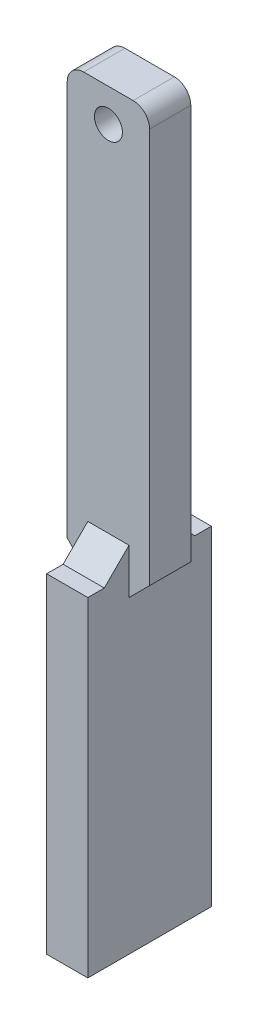
ISO-10303-21;
HEADER;
FILE_DESCRIPTION(('STEP AP214'),'2;1');
FILE_NAME('part.step','',(''),(''),'','','');
FILE_SCHEMA(('AUTOMOTIVE_DESIGN { 1 0 10303 214 1 1 1 1 }'));
ENDSEC;
DATA;
#1=APPLICATION_CONTEXT('core data for automotive mechanical design processes');
#2=APPLICATION_PROTOCOL_DEFINITION('international standard','automotive_design',2000,#1);
#3=PRODUCT_CONTEXT('',#1,'mechanical');
#4=PRODUCT('Part','Part','',(#3));
#5=PRODUCT_RELATED_PRODUCT_CATEGORY('part','',(#4));
#6=PRODUCT_DEFINITION_FORMATION('','',#4);
#7=PRODUCT_DEFINITION_CONTEXT('part definition',#1,'design');
#8=PRODUCT_DEFINITION('design','',#6,#7);
#9=PRODUCT_DEFINITION_SHAPE('','',#8);
#10=(LENGTH_UNIT() NAMED_UNIT(*) SI_UNIT(.MILLI.,.METRE.));
#11=(NAMED_UNIT(*) PLANE_ANGLE_UNIT() SI_UNIT($,.RADIAN.));
#12=(NAMED_UNIT(*) SI_UNIT($,.STERADIAN.) SOLID_ANGLE_UNIT());
#13=UNCERTAINTY_MEASURE_WITH_UNIT(LENGTH_MEASURE(1.E-05),#10,'distance_accuracy_value','');
#14=(GEOMETRIC_REPRESENTATION_CONTEXT(3) GLOBAL_UNCERTAINTY_ASSIGNED_CONTEXT((#13)) GLOBAL_UNIT_ASSIGNED_CONTEXT((#10,
#11,#12)) REPRESENTATION_CONTEXT('',''));
#15=CARTESIAN_POINT('',(0.,0.,0.));
#16=DIRECTION('',(0.,0.,1.));
#17=DIRECTION('',(1.,0.,0.));
#18=AXIS2_PLACEMENT_3D('',#15,#16,#17);
#19=CARTESIAN_POINT('',(5.05025253169417,-54.9497474683058,5.));
#20=DIRECTION('',(0.699964648241025,0.714177492793506,0.));
#21=DIRECTION('',(-0.714177492793506,0.699964648241025,0.));
#22=AXIS2_PLACEMENT_3D('',#19,#20,#21);
#23=PLANE('',#22);
#24=DIRECTION('',(0.,0.,-1.));
#25=VECTOR('',#24,1.);
#26=CARTESIAN_POINT('',(2.50000000000001,-52.4502475060615,5.));
#27=LINE('',#26,#25);
#28=CARTESIAN_POINT('',(2.50000000000001,-52.4502475060615,5.));
#29=VERTEX_POINT('',#28);
#30=CARTESIAN_POINT('',(2.50000000000001,-52.4502475060615,0.));
#31=VERTEX_POINT('',#30);
#32=EDGE_CURVE('E165',#29,#31,#27,.T.);
#33=ORIENTED_EDGE('',*,*,#32,.F.);
#34=DIRECTION('',(0.714177492793506,-0.699964648241025,0.));
#35=VECTOR('',#34,1.);
#36=CARTESIAN_POINT('',(5.05025253169417,-54.9497474683058,5.));
#37=LINE('',#36,#35);
#38=CARTESIAN_POINT('',(0.,-50.,5.));
#39=VERTEX_POINT('',#38);
#40=EDGE_CURVE('E206',#39,#29,#37,.T.);
#41=ORIENTED_EDGE('',*,*,#40,.F.);
#42=DIRECTION('',(0.,0.,-1.));
#43=VECTOR('',#42,1.);
#44=CARTESIAN_POINT('',(0.,-50.,5.));
#45=LINE('',#44,#43);
#46=CARTESIAN_POINT('',(0.,-50.,0.));
#47=VERTEX_POINT('',#46);
#48=EDGE_CURVE('E233',#39,#47,#45,.T.);
#49=ORIENTED_EDGE('',*,*,#48,.T.);
#50=DIRECTION('',(0.714177492793506,-0.699964648241025,0.));
#51=VECTOR('',#50,1.);
#52=CARTESIAN_POINT('',(5.05025253169417,-54.9497474683058,0.));
#53=LINE('',#52,#51);
#54=EDGE_CURVE('E221',#47,#31,#53,.T.);
#55=ORIENTED_EDGE('',*,*,#54,.T.);
#56=EDGE_LOOP('',(#33,#41,#49,#55));
#57=FACE_BOUND('',#56,.T.);
#58=ADVANCED_FACE('F33',(#57),#23,.F.);
#59=CARTESIAN_POINT('',(10.,-50.,5.));
#60=DIRECTION('',(-0.707106781186546,0.707106781186549,0.));
#61=DIRECTION('',(-0.707106781186549,-0.707106781186546,0.));
#62=AXIS2_PLACEMENT_3D('',#59,#60,#61);
#63=PLANE('',#62);
#64=DIRECTION('',(0.,0.,1.));
#65=VECTOR('',#64,1.);
#66=CARTESIAN_POINT('',(7.50000000000001,-52.5,5.));
#67=LINE('',#66,#65);
#68=CARTESIAN_POINT('',(7.50000000000001,-52.5,0.));
#69=VERTEX_POINT('',#68);
#70=CARTESIAN_POINT('',(7.50000000000001,-52.5,5.));
#71=VERTEX_POINT('',#70);
#72=EDGE_CURVE('E196',#69,#71,#67,.T.);
#73=ORIENTED_EDGE('',*,*,#72,.F.);
#74=DIRECTION('',(0.707106781186549,0.707106781186546,0.));
#75=VECTOR('',#74,1.);
#76=CARTESIAN_POINT('',(10.,-50.,0.));
#77=LINE('',#76,#75);
#78=CARTESIAN_POINT('',(10.,-50.,0.));
#79=VERTEX_POINT('',#78);
#80=EDGE_CURVE('E224',#69,#79,#77,.T.);
#81=ORIENTED_EDGE('',*,*,#80,.T.);
#82=DIRECTION('',(0.,0.,-1.));
#83=VECTOR('',#82,1.);
#84=CARTESIAN_POINT('',(10.,-50.,5.));
#85=LINE('',#84,#83);
#86=CARTESIAN_POINT('',(10.,-50.,5.));
#87=VERTEX_POINT('',#86);
#88=EDGE_CURVE('E218',#87,#79,#85,.T.);
#89=ORIENTED_EDGE('',*,*,#88,.F.);
#90=DIRECTION('',(0.707106781186549,0.707106781186546,0.));
#91=VECTOR('',#90,1.);
#92=CARTESIAN_POINT('',(10.,-50.,5.));
#93=LINE('',#92,#91);
#94=EDGE_CURVE('E210',#71,#87,#93,.T.);
#95=ORIENTED_EDGE('',*,*,#94,.F.);
#96=EDGE_LOOP('',(#73,#81,#89,#95));
#97=FACE_BOUND('',#96,.T.);
#98=ADVANCED_FACE('F291',(#97),#63,.F.);
#99=CARTESIAN_POINT('',(0.,0.,5.));
#100=DIRECTION('',(0.,0.,-1.));
#101=DIRECTION('',(-1.,0.,0.));
#102=AXIS2_PLACEMENT_3D('',#99,#100,#101);
#103=PLANE('',#102);
#104=CARTESIAN_POINT('',(5.,-4.,5.));
#105=DIRECTION('',(0.,0.,1.));
#106=DIRECTION('',(1.,0.,0.));
#107=AXIS2_PLACEMENT_3D('',#104,#105,#106);
#108=CIRCLE('',#107,1.7);
#109=CARTESIAN_POINT('',(6.7,-4.,5.));
#110=VERTEX_POINT('',#109);
#111=EDGE_CURVE('E200',#110,#110,#108,.T.);
#112=ORIENTED_EDGE('',*,*,#111,.F.);
#113=EDGE_LOOP('',(#112));
#114=FACE_BOUND('',#113,.T.);
#115=DIRECTION('',(1.,0.,0.));
#116=VECTOR('',#115,1.);
#117=CARTESIAN_POINT('',(0.,-47.,5.));
#118=LINE('',#117,#116);
#119=CARTESIAN_POINT('',(2.50000000000001,-47.,5.));
#120=VERTEX_POINT('',#119);
#121=CARTESIAN_POINT('',(7.50000000000001,-47.,5.));
#122=VERTEX_POINT('',#121);
#123=EDGE_CURVE('E266',#120,#122,#118,.T.);
#124=ORIENTED_EDGE('',*,*,#123,.T.);
#125=DIRECTION('',(0.,1.,0.));
#126=VECTOR('',#125,1.);
#127=CARTESIAN_POINT('',(7.50000000000001,0.,5.));
#128=LINE('',#127,#126);
#129=EDGE_CURVE('E198',#71,#122,#128,.T.);
#130=ORIENTED_EDGE('',*,*,#129,.F.);
#131=ORIENTED_EDGE('',*,*,#94,.T.);
#132=DIRECTION('',(0.,1.,0.));
#133=VECTOR('',#132,1.);
#134=CARTESIAN_POINT('',(10.,0.,5.));
#135=LINE('',#134,#133);
#136=CARTESIAN_POINT('',(10.,-2.,5.));
#137=VERTEX_POINT('',#136);
#138=EDGE_CURVE('E212',#87,#137,#135,.T.);
#139=ORIENTED_EDGE('',*,*,#138,.T.);
#140=CARTESIAN_POINT('',(8.,-2.,5.));
#141=DIRECTION('',(0.,0.,-1.));
#142=DIRECTION('',(-1.,0.,0.));
#143=AXIS2_PLACEMENT_3D('',#140,#141,#142);
#144=CIRCLE('',#143,2.);
#145=CARTESIAN_POINT('',(8.,0.,5.));
#146=VERTEX_POINT('',#145);
#147=EDGE_CURVE('E248',#137,#146,#144,.F.);
#148=ORIENTED_EDGE('',*,*,#147,.T.);
#149=DIRECTION('',(-1.,0.,0.));
#150=VECTOR('',#149,1.);
#151=CARTESIAN_POINT('',(0.,0.,5.));
#152=LINE('',#151,#150);
#153=CARTESIAN_POINT('',(2.,0.,5.));
#154=VERTEX_POINT('',#153);
#155=EDGE_CURVE('E215',#146,#154,#152,.T.);
#156=ORIENTED_EDGE('',*,*,#155,.T.);
#157=CARTESIAN_POINT('',(2.,-2.,5.));
#158=DIRECTION('',(0.,0.,-1.));
#159=DIRECTION('',(-1.,0.,0.));
#160=AXIS2_PLACEMENT_3D('',#157,#158,#159);
#161=CIRCLE('',#160,2.);
#162=CARTESIAN_POINT('',(0.,-2.,5.));
#163=VERTEX_POINT('',#162);
#164=EDGE_CURVE('E250',#154,#163,#161,.F.);
#165=ORIENTED_EDGE('',*,*,#164,.T.);
#166=DIRECTION('',(0.,-1.,0.));
#167=VECTOR('',#166,1.);
#168=CARTESIAN_POINT('',(0.,-50.,5.));
#169=LINE('',#168,#167);
#170=EDGE_CURVE('E204',#163,#39,#169,.T.);
#171=ORIENTED_EDGE('',*,*,#170,.T.);
#172=ORIENTED_EDGE('',*,*,#40,.T.);
#173=DIRECTION('',(0.,-1.,0.));
#174=VECTOR('',#173,1.);
#175=CARTESIAN_POINT('',(2.50000000000001,0.,5.));
#176=LINE('',#175,#174);
#177=EDGE_CURVE('E193',#120,#29,#176,.T.);
#178=ORIENTED_EDGE('',*,*,#177,.F.);
#179=EDGE_LOOP('',(#124,#130,#131,#139,#148,#156,#165,#171,#172,#178));
#180=FACE_BOUND('',#179,.T.);
#181=ADVANCED_FACE('F299',(#114,#180),#103,.F.);
#182=CARTESIAN_POINT('',(0.,0.,0.));
#183=DIRECTION('',(0.,0.,-1.));
#184=DIRECTION('',(-1.,0.,0.));
#185=AXIS2_PLACEMENT_3D('',#182,#183,#184);
#186=PLANE('',#185);
#187=CARTESIAN_POINT('',(5.,-4.,0.));
#188=DIRECTION('',(0.,0.,-1.));
#189=DIRECTION('',(-1.,0.,0.));
#190=AXIS2_PLACEMENT_3D('',#187,#188,#189);
#191=CIRCLE('',#190,1.7);
#192=CARTESIAN_POINT('',(3.3,-4.,0.));
#193=VERTEX_POINT('',#192);
#194=EDGE_CURVE('E203',#193,#193,#191,.T.);
#195=ORIENTED_EDGE('',*,*,#194,.F.);
#196=EDGE_LOOP('',(#195));
#197=FACE_BOUND('',#196,.T.);
#198=DIRECTION('',(0.,1.,0.));
#199=VECTOR('',#198,1.);
#200=CARTESIAN_POINT('',(7.50000000000001,0.,0.));
#201=LINE('',#200,#199);
#202=CARTESIAN_POINT('',(7.50000000000001,-47.,0.));
#203=VERTEX_POINT('',#202);
#204=EDGE_CURVE('E258',#69,#203,#201,.T.);
#205=ORIENTED_EDGE('',*,*,#204,.T.);
#206=DIRECTION('',(-1.,0.,0.));
#207=VECTOR('',#206,1.);
#208=CARTESIAN_POINT('',(2.50000000000001,-47.,0.));
#209=LINE('',#208,#207);
#210=CARTESIAN_POINT('',(2.50000000000001,-47.,0.));
#211=VERTEX_POINT('',#210);
#212=EDGE_CURVE('E263',#203,#211,#209,.T.);
#213=ORIENTED_EDGE('',*,*,#212,.T.);
#214=DIRECTION('',(0.,-1.,0.));
#215=VECTOR('',#214,1.);
#216=CARTESIAN_POINT('',(2.50000000000001,0.,0.));
#217=LINE('',#216,#215);
#218=EDGE_CURVE('E254',#211,#31,#217,.T.);
#219=ORIENTED_EDGE('',*,*,#218,.T.);
#220=ORIENTED_EDGE('',*,*,#54,.F.);
#221=DIRECTION('',(0.,-1.,0.));
#222=VECTOR('',#221,1.);
#223=CARTESIAN_POINT('',(0.,-50.,0.));
#224=LINE('',#223,#222);
#225=CARTESIAN_POINT('',(0.,-2.,0.));
#226=VERTEX_POINT('',#225);
#227=EDGE_CURVE('E219',#226,#47,#224,.T.);
#228=ORIENTED_EDGE('',*,*,#227,.F.);
#229=CARTESIAN_POINT('',(2.,-2.,0.));
#230=DIRECTION('',(0.,0.,-1.));
#231=DIRECTION('',(-1.,0.,0.));
#232=AXIS2_PLACEMENT_3D('',#229,#230,#231);
#233=CIRCLE('',#232,2.);
#234=CARTESIAN_POINT('',(2.,0.,0.));
#235=VERTEX_POINT('',#234);
#236=EDGE_CURVE('E241',#226,#235,#233,.T.);
#237=ORIENTED_EDGE('',*,*,#236,.T.);
#238=DIRECTION('',(-1.,0.,0.));
#239=VECTOR('',#238,1.);
#240=CARTESIAN_POINT('',(0.,0.,0.));
#241=LINE('',#240,#239);
#242=CARTESIAN_POINT('',(8.,0.,0.));
#243=VERTEX_POINT('',#242);
#244=EDGE_CURVE('E207',#243,#235,#241,.T.);
#245=ORIENTED_EDGE('',*,*,#244,.F.);
#246=CARTESIAN_POINT('',(8.,-2.,0.));
#247=DIRECTION('',(0.,0.,-1.));
#248=DIRECTION('',(-1.,0.,0.));
#249=AXIS2_PLACEMENT_3D('',#246,#247,#248);
#250=CIRCLE('',#249,2.);
#251=CARTESIAN_POINT('',(10.,-2.,0.));
#252=VERTEX_POINT('',#251);
#253=EDGE_CURVE('E239',#243,#252,#250,.T.);
#254=ORIENTED_EDGE('',*,*,#253,.T.);
#255=DIRECTION('',(0.,1.,0.));
#256=VECTOR('',#255,1.);
#257=CARTESIAN_POINT('',(10.,0.,0.));
#258=LINE('',#257,#256);
#259=EDGE_CURVE('E226',#79,#252,#258,.T.);
#260=ORIENTED_EDGE('',*,*,#259,.F.);
#261=ORIENTED_EDGE('',*,*,#80,.F.);
#262=EDGE_LOOP('',(#205,#213,#219,#220,#228,#237,#245,#254,#260,#261));
#263=FACE_BOUND('',#262,.T.);
#264=ADVANCED_FACE('F287',(#197,#263),#186,.T.);
#265=CARTESIAN_POINT('',(0.,-50.,5.));
#266=DIRECTION('',(1.,0.,0.));
#267=DIRECTION('',(0.,0.,-1.));
#268=AXIS2_PLACEMENT_3D('',#265,#266,#267);
#269=PLANE('',#268);
#270=ORIENTED_EDGE('',*,*,#170,.F.);
#271=DIRECTION('',(0.,0.,-1.));
#272=VECTOR('',#271,1.);
#273=CARTESIAN_POINT('',(0.,-2.,5.));
#274=LINE('',#273,#272);
#275=EDGE_CURVE('E236',#163,#226,#274,.T.);
#276=ORIENTED_EDGE('',*,*,#275,.T.);
#277=ORIENTED_EDGE('',*,*,#227,.T.);
#278=ORIENTED_EDGE('',*,*,#48,.F.);
#279=EDGE_LOOP('',(#270,#276,#277,#278));
#280=FACE_BOUND('',#279,.T.);
#281=ADVANCED_FACE('F316',(#280),#269,.F.);
#282=CARTESIAN_POINT('',(10.,0.,5.));
#283=DIRECTION('',(-1.,0.,0.));
#284=DIRECTION('',(0.,-1.,0.));
#285=AXIS2_PLACEMENT_3D('',#282,#283,#284);
#286=PLANE('',#285);
#287=ORIENTED_EDGE('',*,*,#259,.T.);
#288=DIRECTION('',(0.,0.,-1.));
#289=VECTOR('',#288,1.);
#290=CARTESIAN_POINT('',(10.,-2.,5.));
#291=LINE('',#290,#289);
#292=EDGE_CURVE('E252',#252,#137,#291,.F.);
#293=ORIENTED_EDGE('',*,*,#292,.T.);
#294=ORIENTED_EDGE('',*,*,#138,.F.);
#295=ORIENTED_EDGE('',*,*,#88,.T.);
#296=EDGE_LOOP('',(#287,#293,#294,#295));
#297=FACE_BOUND('',#296,.T.);
#298=ADVANCED_FACE('F295',(#297),#286,.F.);
#299=CARTESIAN_POINT('',(0.,0.,5.));
#300=DIRECTION('',(0.,-1.,0.));
#301=DIRECTION('',(0.,0.,-1.));
#302=AXIS2_PLACEMENT_3D('',#299,#300,#301);
#303=PLANE('',#302);
#304=ORIENTED_EDGE('',*,*,#244,.T.);
#305=DIRECTION('',(0.,0.,-1.));
#306=VECTOR('',#305,1.);
#307=CARTESIAN_POINT('',(2.,0.,5.));
#308=LINE('',#307,#306);
#309=EDGE_CURVE('E246',#235,#154,#308,.F.);
#310=ORIENTED_EDGE('',*,*,#309,.T.);
#311=ORIENTED_EDGE('',*,*,#155,.F.);
#312=DIRECTION('',(0.,0.,-1.));
#313=VECTOR('',#312,1.);
#314=CARTESIAN_POINT('',(8.,0.,5.));
#315=LINE('',#314,#313);
#316=EDGE_CURVE('E243',#146,#243,#315,.T.);
#317=ORIENTED_EDGE('',*,*,#316,.T.);
#318=EDGE_LOOP('',(#304,#310,#311,#317));
#319=FACE_BOUND('',#318,.T.);
#320=ADVANCED_FACE('F306',(#319),#303,.F.);
#321=CARTESIAN_POINT('',(2.,-2.,5.));
#322=DIRECTION('',(0.,0.,-1.));
#323=DIRECTION('',(-1.,0.,0.));
#324=AXIS2_PLACEMENT_3D('',#321,#322,#323);
#325=CYLINDRICAL_SURFACE('',#324,2.);
#326=ORIENTED_EDGE('',*,*,#164,.F.);
#327=ORIENTED_EDGE('',*,*,#309,.F.);
#328=ORIENTED_EDGE('',*,*,#236,.F.);
#329=ORIENTED_EDGE('',*,*,#275,.F.);
#330=EDGE_LOOP('',(#326,#327,#328,#329));
#331=FACE_BOUND('',#330,.T.);
#332=ADVANCED_FACE('F313',(#331),#325,.T.);
#333=CARTESIAN_POINT('',(8.,-2.,5.));
#334=DIRECTION('',(0.,0.,-1.));
#335=DIRECTION('',(-1.,0.,0.));
#336=AXIS2_PLACEMENT_3D('',#333,#334,#335);
#337=CYLINDRICAL_SURFACE('',#336,2.);
#338=ORIENTED_EDGE('',*,*,#147,.F.);
#339=ORIENTED_EDGE('',*,*,#292,.F.);
#340=ORIENTED_EDGE('',*,*,#253,.F.);
#341=ORIENTED_EDGE('',*,*,#316,.F.);
#342=EDGE_LOOP('',(#338,#339,#340,#341));
#343=FACE_BOUND('',#342,.T.);
#344=ADVANCED_FACE('F303',(#343),#337,.T.);
#345=CARTESIAN_POINT('',(5.,-4.,-7.));
#346=DIRECTION('',(0.,0.,1.));
#347=DIRECTION('',(1.,0.,0.));
#348=AXIS2_PLACEMENT_3D('',#345,#346,#347);
#349=CYLINDRICAL_SURFACE('',#348,1.7);
#350=ORIENTED_EDGE('',*,*,#194,.T.);
#351=EDGE_LOOP('',(#350));
#352=FACE_BOUND('',#351,.T.);
#353=ORIENTED_EDGE('',*,*,#111,.T.);
#354=EDGE_LOOP('',(#353));
#355=FACE_BOUND('',#354,.T.);
#356=ADVANCED_FACE('F340',(#352,#355),#349,.F.);
#357=CARTESIAN_POINT('',(7.50000000000001,-90.,10.));
#358=DIRECTION('',(-1.,0.,0.));
#359=DIRECTION('',(0.,0.,1.));
#360=AXIS2_PLACEMENT_3D('',#357,#358,#359);
#361=PLANE('',#360);
#362=ORIENTED_EDGE('',*,*,#72,.T.);
#363=ORIENTED_EDGE('',*,*,#129,.T.);
#364=DIRECTION('',(0.,-0.707106781186551,0.707106781186544));
#365=VECTOR('',#364,1.);
#366=CARTESIAN_POINT('',(7.50000000000001,-71.0000000000002,29.));
#367=LINE('',#366,#365);
#368=CARTESIAN_POINT('',(7.50000000000001,-50.,7.99999999999998));
#369=VERTEX_POINT('',#368);
#370=EDGE_CURVE('E41',#122,#369,#367,.T.);
#371=ORIENTED_EDGE('',*,*,#370,.T.);
#372=DIRECTION('',(0.,0.,1.));
#373=VECTOR('',#372,1.);
#374=CARTESIAN_POINT('',(7.50000000000001,-50.,10.));
#375=LINE('',#374,#373);
#376=CARTESIAN_POINT('',(7.50000000000001,-50.,10.));
#377=VERTEX_POINT('',#376);
#378=EDGE_CURVE('E179',#369,#377,#375,.T.);
#379=ORIENTED_EDGE('',*,*,#378,.T.);
#380=DIRECTION('',(0.,1.,0.));
#381=VECTOR('',#380,1.);
#382=CARTESIAN_POINT('',(7.50000000000001,-90.,10.));
#383=LINE('',#382,#381);
#384=CARTESIAN_POINT('',(7.50000000000001,-90.,10.));
#385=VERTEX_POINT('',#384);
#386=EDGE_CURVE('E166',#385,#377,#383,.T.);
#387=ORIENTED_EDGE('',*,*,#386,.F.);
#388=DIRECTION('',(0.,0.,1.));
#389=VECTOR('',#388,1.);
#390=CARTESIAN_POINT('',(7.50000000000001,-90.,10.));
#391=LINE('',#390,#389);
#392=CARTESIAN_POINT('',(7.50000000000001,-90.,-5.));
#393=VERTEX_POINT('',#392);
#394=EDGE_CURVE('E149',#393,#385,#391,.T.);
#395=ORIENTED_EDGE('',*,*,#394,.F.);
#396=DIRECTION('',(0.,1.,0.));
#397=VECTOR('',#396,1.);
#398=CARTESIAN_POINT('',(7.50000000000001,-90.,-5.));
#399=LINE('',#398,#397);
#400=CARTESIAN_POINT('',(7.50000000000001,-50.,-5.));
#401=VERTEX_POINT('',#400);
#402=EDGE_CURVE('E159',#393,#401,#399,.T.);
#403=ORIENTED_EDGE('',*,*,#402,.T.);
#404=CARTESIAN_POINT('',(7.50000000000001,-50.,-3.00000000000002));
#405=VERTEX_POINT('',#404);
#406=EDGE_CURVE('E180',#401,#405,#375,.T.);
#407=ORIENTED_EDGE('',*,*,#406,.T.);
#408=DIRECTION('',(0.,-0.707106781186543,-0.707106781186552));
#409=VECTOR('',#408,1.);
#410=CARTESIAN_POINT('',(7.50000000000001,-63.4999999999997,-16.4999999999999));
#411=LINE('',#410,#409);
#412=EDGE_CURVE('E270',#405,#203,#411,.F.);
#413=ORIENTED_EDGE('',*,*,#412,.T.);
#414=ORIENTED_EDGE('',*,*,#204,.F.);
#415=EDGE_LOOP('',(#362,#363,#371,#379,#387,#395,#403,#407,#413,#414));
#416=FACE_BOUND('',#415,.T.);
#417=ADVANCED_FACE('F169',(#416),#361,.F.);
#418=CARTESIAN_POINT('',(2.50000000000001,-90.,10.));
#419=DIRECTION('',(1.,0.,0.));
#420=DIRECTION('',(0.,0.,-1.));
#421=AXIS2_PLACEMENT_3D('',#418,#419,#420);
#422=PLANE('',#421);
#423=DIRECTION('',(0.,0.,-1.));
#424=VECTOR('',#423,1.);
#425=CARTESIAN_POINT('',(2.50000000000001,-50.,10.));
#426=LINE('',#425,#424);
#427=CARTESIAN_POINT('',(2.50000000000001,-50.,10.));
#428=VERTEX_POINT('',#427);
#429=CARTESIAN_POINT('',(2.50000000000001,-50.,7.99999999999998));
#430=VERTEX_POINT('',#429);
#431=EDGE_CURVE('E156',#428,#430,#426,.T.);
#432=ORIENTED_EDGE('',*,*,#431,.T.);
#433=DIRECTION('',(0.,0.707106781186551,-0.707106781186544));
#434=VECTOR('',#433,1.);
#435=CARTESIAN_POINT('',(2.50000000000001,-71.0000000000002,29.));
#436=LINE('',#435,#434);
#437=EDGE_CURVE('E11',#430,#120,#436,.T.);
#438=ORIENTED_EDGE('',*,*,#437,.T.);
#439=ORIENTED_EDGE('',*,*,#177,.T.);
#440=ORIENTED_EDGE('',*,*,#32,.T.);
#441=ORIENTED_EDGE('',*,*,#218,.F.);
#442=DIRECTION('',(0.,0.707106781186543,0.707106781186552));
#443=VECTOR('',#442,1.);
#444=CARTESIAN_POINT('',(2.50000000000001,-63.4999999999997,-16.4999999999999));
#445=LINE('',#444,#443);
#446=CARTESIAN_POINT('',(2.50000000000001,-50.,-3.00000000000002));
#447=VERTEX_POINT('',#446);
#448=EDGE_CURVE('E273',#211,#447,#445,.F.);
#449=ORIENTED_EDGE('',*,*,#448,.T.);
#450=CARTESIAN_POINT('',(2.50000000000001,-50.,-5.));
#451=VERTEX_POINT('',#450);
#452=EDGE_CURVE('E184',#447,#451,#426,.T.);
#453=ORIENTED_EDGE('',*,*,#452,.T.);
#454=DIRECTION('',(0.,1.,0.));
#455=VECTOR('',#454,1.);
#456=CARTESIAN_POINT('',(2.50000000000001,-90.,-5.));
#457=LINE('',#456,#455);
#458=CARTESIAN_POINT('',(2.50000000000001,-90.,-5.));
#459=VERTEX_POINT('',#458);
#460=EDGE_CURVE('E177',#459,#451,#457,.T.);
#461=ORIENTED_EDGE('',*,*,#460,.F.);
#462=DIRECTION('',(0.,0.,-1.));
#463=VECTOR('',#462,1.);
#464=CARTESIAN_POINT('',(2.50000000000001,-90.,10.));
#465=LINE('',#464,#463);
#466=CARTESIAN_POINT('',(2.50000000000001,-90.,10.));
#467=VERTEX_POINT('',#466);
#468=EDGE_CURVE('E152',#467,#459,#465,.T.);
#469=ORIENTED_EDGE('',*,*,#468,.F.);
#470=DIRECTION('',(0.,1.,0.));
#471=VECTOR('',#470,1.);
#472=CARTESIAN_POINT('',(2.50000000000001,-90.,10.));
#473=LINE('',#472,#471);
#474=EDGE_CURVE('E187',#467,#428,#473,.T.);
#475=ORIENTED_EDGE('',*,*,#474,.T.);
#476=EDGE_LOOP('',(#432,#438,#439,#440,#441,#449,#453,#461,#469,#475));
#477=FACE_BOUND('',#476,.T.);
#478=ADVANCED_FACE('F277',(#477),#422,.F.);
#479=CARTESIAN_POINT('',(0.,-50.,0.));
#480=DIRECTION('',(0.,1.,0.));
#481=DIRECTION('',(0.,0.,1.));
#482=AXIS2_PLACEMENT_3D('',#479,#480,#481);
#483=PLANE('',#482);
#484=ORIENTED_EDGE('',*,*,#378,.F.);
#485=DIRECTION('',(-1.,0.,0.));
#486=VECTOR('',#485,1.);
#487=CARTESIAN_POINT('',(0.,-50.,7.99999999999998));
#488=LINE('',#487,#486);
#489=EDGE_CURVE('E54',#369,#430,#488,.T.);
#490=ORIENTED_EDGE('',*,*,#489,.T.);
#491=ORIENTED_EDGE('',*,*,#431,.F.);
#492=DIRECTION('',(-1.,0.,0.));
#493=VECTOR('',#492,1.);
#494=CARTESIAN_POINT('',(7.50000000000001,-50.,10.));
#495=LINE('',#494,#493);
#496=EDGE_CURVE('E182',#377,#428,#495,.T.);
#497=ORIENTED_EDGE('',*,*,#496,.F.);
#498=EDGE_LOOP('',(#484,#490,#491,#497));
#499=FACE_BOUND('',#498,.T.);
#500=ADVANCED_FACE('F404',(#499),#483,.T.);
#501=CARTESIAN_POINT('',(7.50000000000001,-90.,-5.));
#502=DIRECTION('',(0.,0.,1.));
#503=DIRECTION('',(1.,0.,0.));
#504=AXIS2_PLACEMENT_3D('',#501,#502,#503);
#505=PLANE('',#504);
#506=DIRECTION('',(1.,0.,0.));
#507=VECTOR('',#506,1.);
#508=CARTESIAN_POINT('',(7.50000000000001,-50.,-5.));
#509=LINE('',#508,#507);
#510=EDGE_CURVE('E162',#451,#401,#509,.T.);
#511=ORIENTED_EDGE('',*,*,#510,.T.);
#512=ORIENTED_EDGE('',*,*,#402,.F.);
#513=DIRECTION('',(1.,0.,0.));
#514=VECTOR('',#513,1.);
#515=CARTESIAN_POINT('',(2.50000000000001,-90.,-5.));
#516=LINE('',#515,#514);
#517=EDGE_CURVE('E145',#459,#393,#516,.T.);
#518=ORIENTED_EDGE('',*,*,#517,.F.);
#519=ORIENTED_EDGE('',*,*,#460,.T.);
#520=EDGE_LOOP('',(#511,#512,#518,#519));
#521=FACE_BOUND('',#520,.T.);
#522=ADVANCED_FACE('F160',(#521),#505,.F.);
#523=CARTESIAN_POINT('',(7.50000000000001,-90.,10.));
#524=DIRECTION('',(0.,0.,-1.));
#525=DIRECTION('',(-1.,0.,0.));
#526=AXIS2_PLACEMENT_3D('',#523,#524,#525);
#527=PLANE('',#526);
#528=ORIENTED_EDGE('',*,*,#496,.T.);
#529=ORIENTED_EDGE('',*,*,#474,.F.);
#530=DIRECTION('',(-1.,0.,0.));
#531=VECTOR('',#530,1.);
#532=CARTESIAN_POINT('',(7.50000000000001,-90.,10.));
#533=LINE('',#532,#531);
#534=EDGE_CURVE('E172',#385,#467,#533,.T.);
#535=ORIENTED_EDGE('',*,*,#534,.F.);
#536=ORIENTED_EDGE('',*,*,#386,.T.);
#537=EDGE_LOOP('',(#528,#529,#535,#536));
#538=FACE_BOUND('',#537,.T.);
#539=ADVANCED_FACE('F403',(#538),#527,.F.);
#540=CARTESIAN_POINT('',(0.,-90.,0.));
#541=DIRECTION('',(0.,1.,0.));
#542=DIRECTION('',(0.,0.,1.));
#543=AXIS2_PLACEMENT_3D('',#540,#541,#542);
#544=PLANE('',#543);
#545=ORIENTED_EDGE('',*,*,#517,.T.);
#546=ORIENTED_EDGE('',*,*,#394,.T.);
#547=ORIENTED_EDGE('',*,*,#534,.T.);
#548=ORIENTED_EDGE('',*,*,#468,.T.);
#549=EDGE_LOOP('',(#545,#546,#547,#548));
#550=FACE_BOUND('',#549,.T.);
#551=ADVANCED_FACE('F147',(#550),#544,.F.);
#552=ORIENTED_EDGE('',*,*,#452,.F.);
#553=DIRECTION('',(1.,0.,0.));
#554=VECTOR('',#553,1.);
#555=CARTESIAN_POINT('',(7.50000000000001,-50.,-3.00000000000002));
#556=LINE('',#555,#554);
#557=EDGE_CURVE('E260',#447,#405,#556,.T.);
#558=ORIENTED_EDGE('',*,*,#557,.T.);
#559=ORIENTED_EDGE('',*,*,#406,.F.);
#560=ORIENTED_EDGE('',*,*,#510,.F.);
#561=EDGE_LOOP('',(#552,#558,#559,#560));
#562=FACE_BOUND('',#561,.T.);
#563=ADVANCED_FACE('F282',(#562),#483,.T.);
#564=CARTESIAN_POINT('',(0.,-50.,-3.00000000000002));
#565=DIRECTION('',(0.,0.707106781186552,-0.707106781186543));
#566=DIRECTION('',(-1.,0.,0.));
#567=AXIS2_PLACEMENT_3D('',#564,#565,#566);
#568=PLANE('',#567);
#569=ORIENTED_EDGE('',*,*,#448,.F.);
#570=ORIENTED_EDGE('',*,*,#212,.F.);
#571=ORIENTED_EDGE('',*,*,#412,.F.);
#572=ORIENTED_EDGE('',*,*,#557,.F.);
#573=EDGE_LOOP('',(#569,#570,#571,#572));
#574=FACE_BOUND('',#573,.T.);
#575=ADVANCED_FACE('F283',(#574),#568,.T.);
#576=CARTESIAN_POINT('',(0.,-47.,5.));
#577=DIRECTION('',(0.,-0.707106781186544,-0.707106781186551));
#578=DIRECTION('',(1.,0.,0.));
#579=AXIS2_PLACEMENT_3D('',#576,#577,#578);
#580=PLANE('',#579);
#581=ORIENTED_EDGE('',*,*,#437,.F.);
#582=ORIENTED_EDGE('',*,*,#489,.F.);
#583=ORIENTED_EDGE('',*,*,#370,.F.);
#584=ORIENTED_EDGE('',*,*,#123,.F.);
#585=EDGE_LOOP('',(#581,#582,#583,#584));
#586=FACE_BOUND('',#585,.T.);
#587=ADVANCED_FACE('F35',(#586),#580,.F.);
#588=CLOSED_SHELL('',(#58,#98,#181,#264,#281,#298,#320,#332,#344,#356,#417,#478,#500,#522,#539,
#551,#563,#575,#587));
#589=MANIFOLD_SOLID_BREP('B2',#588);
#590=ADVANCED_BREP_SHAPE_REPRESENTATION('',(#18,#589),#14);
#591=SHAPE_DEFINITION_REPRESENTATION(#9,#590);
ENDSEC;
END-ISO-10303-21;
